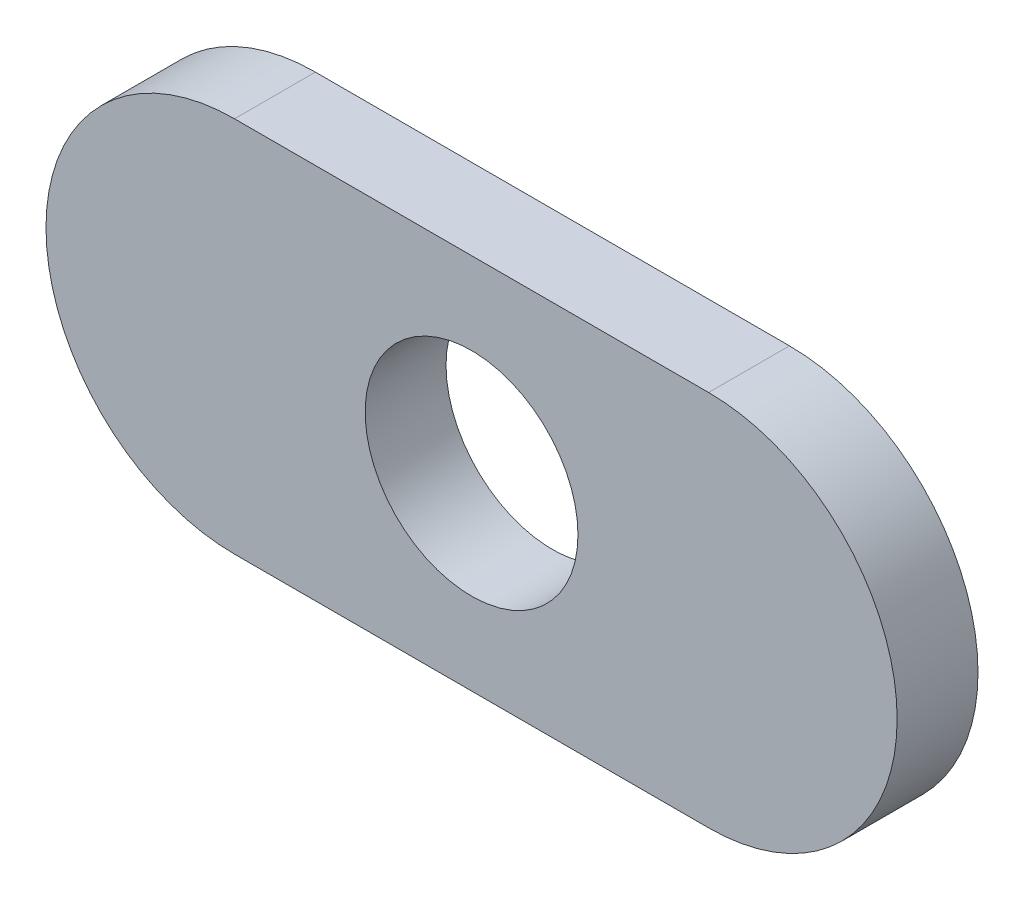
ISO-10303-21;
HEADER;
FILE_DESCRIPTION(('STEP AP214'),'2;1');
FILE_NAME('part.step','',(''),(''),'','','');
FILE_SCHEMA(('AUTOMOTIVE_DESIGN { 1 0 10303 214 1 1 1 1 }'));
ENDSEC;
DATA;
#1=APPLICATION_CONTEXT('core data for automotive mechanical design processes');
#2=APPLICATION_PROTOCOL_DEFINITION('international standard','automotive_design',2000,#1);
#3=PRODUCT_CONTEXT('',#1,'mechanical');
#4=PRODUCT('Part','Part','',(#3));
#5=PRODUCT_RELATED_PRODUCT_CATEGORY('part','',(#4));
#6=PRODUCT_DEFINITION_FORMATION('','',#4);
#7=PRODUCT_DEFINITION_CONTEXT('part definition',#1,'design');
#8=PRODUCT_DEFINITION('design','',#6,#7);
#9=PRODUCT_DEFINITION_SHAPE('','',#8);
#10=(LENGTH_UNIT() NAMED_UNIT(*) SI_UNIT(.MILLI.,.METRE.));
#11=(NAMED_UNIT(*) PLANE_ANGLE_UNIT() SI_UNIT($,.RADIAN.));
#12=(NAMED_UNIT(*) SI_UNIT($,.STERADIAN.) SOLID_ANGLE_UNIT());
#13=UNCERTAINTY_MEASURE_WITH_UNIT(LENGTH_MEASURE(1.E-05),#10,'distance_accuracy_value','');
#14=(GEOMETRIC_REPRESENTATION_CONTEXT(3) GLOBAL_UNCERTAINTY_ASSIGNED_CONTEXT((#13)) GLOBAL_UNIT_ASSIGNED_CONTEXT((#10,
#11,#12)) REPRESENTATION_CONTEXT('',''));
#15=CARTESIAN_POINT('',(0.,0.,0.));
#16=DIRECTION('',(0.,0.,1.));
#17=DIRECTION('',(1.,0.,0.));
#18=AXIS2_PLACEMENT_3D('',#15,#16,#17);
#19=CARTESIAN_POINT('',(111.278662660247,125.933065895994,2.413));
#20=DIRECTION('',(0.,0.,-1.));
#21=DIRECTION('',(-1.,0.,0.));
#22=AXIS2_PLACEMENT_3D('',#19,#20,#21);
#23=CYLINDRICAL_SURFACE('',#22,5.62609999999999);
#24=CARTESIAN_POINT('',(111.278662660247,125.933065895994,0.));
#25=DIRECTION('',(0.,0.,1.));
#26=DIRECTION('',(-1.,0.,0.));
#27=AXIS2_PLACEMENT_3D('',#24,#25,#26);
#28=CIRCLE('',#27,5.62609999999999);
#29=CARTESIAN_POINT('',(111.278662660247,131.559165895994,0.));
#30=VERTEX_POINT('',#29);
#31=CARTESIAN_POINT('',(111.278662660247,120.306965895994,0.));
#32=VERTEX_POINT('',#31);
#33=EDGE_CURVE('E97',#30,#32,#28,.T.);
#34=ORIENTED_EDGE('',*,*,#33,.T.);
#35=DIRECTION('',(0.,0.,-1.));
#36=VECTOR('',#35,1.);
#37=CARTESIAN_POINT('',(111.278662660247,120.306965895994,2.413));
#38=LINE('',#37,#36);
#39=CARTESIAN_POINT('',(111.278662660247,120.306965895994,2.413));
#40=VERTEX_POINT('',#39);
#41=EDGE_CURVE('E11',#40,#32,#38,.T.);
#42=ORIENTED_EDGE('',*,*,#41,.F.);
#43=CARTESIAN_POINT('',(111.278662660247,125.933065895994,2.413));
#44=DIRECTION('',(0.,0.,1.));
#45=DIRECTION('',(-1.,0.,0.));
#46=AXIS2_PLACEMENT_3D('',#43,#44,#45);
#47=CIRCLE('',#46,5.62609999999999);
#48=CARTESIAN_POINT('',(111.278662660247,131.559165895994,2.413));
#49=VERTEX_POINT('',#48);
#50=EDGE_CURVE('E85',#49,#40,#47,.T.);
#51=ORIENTED_EDGE('',*,*,#50,.F.);
#52=DIRECTION('',(0.,0.,-1.));
#53=VECTOR('',#52,1.);
#54=CARTESIAN_POINT('',(111.278662660247,131.559165895994,2.413));
#55=LINE('',#54,#53);
#56=EDGE_CURVE('E93',#49,#30,#55,.T.);
#57=ORIENTED_EDGE('',*,*,#56,.T.);
#58=EDGE_LOOP('',(#34,#42,#51,#57));
#59=FACE_BOUND('',#58,.T.);
#60=ADVANCED_FACE('F34',(#59),#23,.T.);
#61=CARTESIAN_POINT('',(111.278662660247,120.306965895994,2.413));
#62=DIRECTION('',(0.,1.,0.));
#63=DIRECTION('',(0.,0.,1.));
#64=AXIS2_PLACEMENT_3D('',#61,#62,#63);
#65=PLANE('',#64);
#66=DIRECTION('',(1.,0.,0.));
#67=VECTOR('',#66,1.);
#68=CARTESIAN_POINT('',(111.278662660247,120.306965895994,0.));
#69=LINE('',#68,#67);
#70=CARTESIAN_POINT('',(125.426462660247,120.306965895994,0.));
#71=VERTEX_POINT('',#70);
#72=EDGE_CURVE('E89',#32,#71,#69,.T.);
#73=ORIENTED_EDGE('',*,*,#72,.T.);
#74=DIRECTION('',(0.,0.,-1.));
#75=VECTOR('',#74,1.);
#76=CARTESIAN_POINT('',(125.426462660247,120.306965895994,2.413));
#77=LINE('',#76,#75);
#78=CARTESIAN_POINT('',(125.426462660247,120.306965895994,2.413));
#79=VERTEX_POINT('',#78);
#80=EDGE_CURVE('E42',#79,#71,#77,.T.);
#81=ORIENTED_EDGE('',*,*,#80,.F.);
#82=DIRECTION('',(1.,0.,0.));
#83=VECTOR('',#82,1.);
#84=CARTESIAN_POINT('',(111.278662660247,120.306965895994,2.413));
#85=LINE('',#84,#83);
#86=EDGE_CURVE('E80',#40,#79,#85,.T.);
#87=ORIENTED_EDGE('',*,*,#86,.F.);
#88=ORIENTED_EDGE('',*,*,#41,.T.);
#89=EDGE_LOOP('',(#73,#81,#87,#88));
#90=FACE_BOUND('',#89,.T.);
#91=ADVANCED_FACE('F88',(#90),#65,.F.);
#92=CARTESIAN_POINT('',(125.426462660247,125.933065895994,2.413));
#93=DIRECTION('',(0.,0.,-1.));
#94=DIRECTION('',(-1.,0.,0.));
#95=AXIS2_PLACEMENT_3D('',#92,#93,#94);
#96=CYLINDRICAL_SURFACE('',#95,5.62609999999999);
#97=CARTESIAN_POINT('',(125.426462660247,125.933065895994,0.));
#98=DIRECTION('',(0.,0.,1.));
#99=DIRECTION('',(1.,0.,0.));
#100=AXIS2_PLACEMENT_3D('',#97,#98,#99);
#101=CIRCLE('',#100,5.62609999999999);
#102=CARTESIAN_POINT('',(125.426462660247,131.559165895994,0.));
#103=VERTEX_POINT('',#102);
#104=EDGE_CURVE('E67',#71,#103,#101,.T.);
#105=ORIENTED_EDGE('',*,*,#104,.T.);
#106=DIRECTION('',(0.,0.,-1.));
#107=VECTOR('',#106,1.);
#108=CARTESIAN_POINT('',(125.426462660247,131.559165895994,2.413));
#109=LINE('',#108,#107);
#110=CARTESIAN_POINT('',(125.426462660247,131.559165895994,2.413));
#111=VERTEX_POINT('',#110);
#112=EDGE_CURVE('E90',#111,#103,#109,.T.);
#113=ORIENTED_EDGE('',*,*,#112,.F.);
#114=CARTESIAN_POINT('',(125.426462660247,125.933065895994,2.413));
#115=DIRECTION('',(0.,0.,1.));
#116=DIRECTION('',(1.,0.,0.));
#117=AXIS2_PLACEMENT_3D('',#114,#115,#116);
#118=CIRCLE('',#117,5.62609999999999);
#119=EDGE_CURVE('E83',#79,#111,#118,.T.);
#120=ORIENTED_EDGE('',*,*,#119,.F.);
#121=ORIENTED_EDGE('',*,*,#80,.T.);
#122=EDGE_LOOP('',(#105,#113,#120,#121));
#123=FACE_BOUND('',#122,.T.);
#124=ADVANCED_FACE('F91',(#123),#96,.T.);
#125=CARTESIAN_POINT('',(111.278662660247,131.559165895994,2.413));
#126=DIRECTION('',(0.,-1.,0.));
#127=DIRECTION('',(0.,0.,-1.));
#128=AXIS2_PLACEMENT_3D('',#125,#126,#127);
#129=PLANE('',#128);
#130=DIRECTION('',(-1.,0.,0.));
#131=VECTOR('',#130,1.);
#132=CARTESIAN_POINT('',(111.278662660247,131.559165895994,0.));
#133=LINE('',#132,#131);
#134=EDGE_CURVE('E73',#103,#30,#133,.T.);
#135=ORIENTED_EDGE('',*,*,#134,.T.);
#136=ORIENTED_EDGE('',*,*,#56,.F.);
#137=DIRECTION('',(-1.,0.,0.));
#138=VECTOR('',#137,1.);
#139=CARTESIAN_POINT('',(111.278662660247,131.559165895994,2.413));
#140=LINE('',#139,#138);
#141=EDGE_CURVE('E50',#111,#49,#140,.T.);
#142=ORIENTED_EDGE('',*,*,#141,.F.);
#143=ORIENTED_EDGE('',*,*,#112,.T.);
#144=EDGE_LOOP('',(#135,#136,#142,#143));
#145=FACE_BOUND('',#144,.T.);
#146=ADVANCED_FACE('F105',(#145),#129,.F.);
#147=CARTESIAN_POINT('',(111.278662660247,125.933065895994,2.413));
#148=DIRECTION('',(0.,0.,-1.));
#149=DIRECTION('',(-1.,0.,0.));
#150=AXIS2_PLACEMENT_3D('',#147,#148,#149);
#151=PLANE('',#150);
#152=CARTESIAN_POINT('',(118.352562660247,125.933065895994,2.413));
#153=DIRECTION('',(0.,0.,1.));
#154=DIRECTION('',(1.,0.,0.));
#155=AXIS2_PLACEMENT_3D('',#152,#153,#154);
#156=CIRCLE('',#155,3.175);
#157=CARTESIAN_POINT('',(121.527562660247,125.933065895994,2.413));
#158=VERTEX_POINT('',#157);
#159=EDGE_CURVE('E100',#158,#158,#156,.T.);
#160=ORIENTED_EDGE('',*,*,#159,.F.);
#161=EDGE_LOOP('',(#160));
#162=FACE_BOUND('',#161,.T.);
#163=ORIENTED_EDGE('',*,*,#50,.T.);
#164=ORIENTED_EDGE('',*,*,#86,.T.);
#165=ORIENTED_EDGE('',*,*,#119,.T.);
#166=ORIENTED_EDGE('',*,*,#141,.T.);
#167=EDGE_LOOP('',(#163,#164,#165,#166));
#168=FACE_BOUND('',#167,.T.);
#169=ADVANCED_FACE('F81',(#162,#168),#151,.F.);
#170=CARTESIAN_POINT('',(111.278662660247,125.933065895994,0.));
#171=DIRECTION('',(0.,0.,-1.));
#172=DIRECTION('',(-1.,0.,0.));
#173=AXIS2_PLACEMENT_3D('',#170,#171,#172);
#174=PLANE('',#173);
#175=CARTESIAN_POINT('',(118.352562660247,125.933065895994,0.));
#176=DIRECTION('',(0.,0.,-1.));
#177=DIRECTION('',(-1.,0.,0.));
#178=AXIS2_PLACEMENT_3D('',#175,#176,#177);
#179=CIRCLE('',#178,3.175);
#180=CARTESIAN_POINT('',(115.177562660247,125.933065895994,0.));
#181=VERTEX_POINT('',#180);
#182=EDGE_CURVE('E111',#181,#181,#179,.F.);
#183=ORIENTED_EDGE('',*,*,#182,.T.);
#184=EDGE_LOOP('',(#183));
#185=FACE_BOUND('',#184,.T.);
#186=ORIENTED_EDGE('',*,*,#33,.F.);
#187=ORIENTED_EDGE('',*,*,#134,.F.);
#188=ORIENTED_EDGE('',*,*,#104,.F.);
#189=ORIENTED_EDGE('',*,*,#72,.F.);
#190=EDGE_LOOP('',(#186,#187,#188,#189));
#191=FACE_BOUND('',#190,.T.);
#192=ADVANCED_FACE('F108',(#185,#191),#174,.T.);
#193=CARTESIAN_POINT('',(118.352562660247,125.933065895994,-0.00100000000000013));
#194=DIRECTION('',(0.,0.,1.));
#195=DIRECTION('',(1.,0.,0.));
#196=AXIS2_PLACEMENT_3D('',#193,#194,#195);
#197=CYLINDRICAL_SURFACE('',#196,3.175);
#198=ORIENTED_EDGE('',*,*,#182,.F.);
#199=EDGE_LOOP('',(#198));
#200=FACE_BOUND('',#199,.T.);
#201=ORIENTED_EDGE('',*,*,#159,.T.);
#202=EDGE_LOOP('',(#201));
#203=FACE_BOUND('',#202,.T.);
#204=ADVANCED_FACE('F117',(#200,#203),#197,.F.);
#205=CLOSED_SHELL('',(#60,#91,#124,#146,#169,#192,#204));
#206=MANIFOLD_SOLID_BREP('B2',#205);
#207=ADVANCED_BREP_SHAPE_REPRESENTATION('',(#18,#206),#14);
#208=SHAPE_DEFINITION_REPRESENTATION(#9,#207);
ENDSEC;
END-ISO-10303-21;
